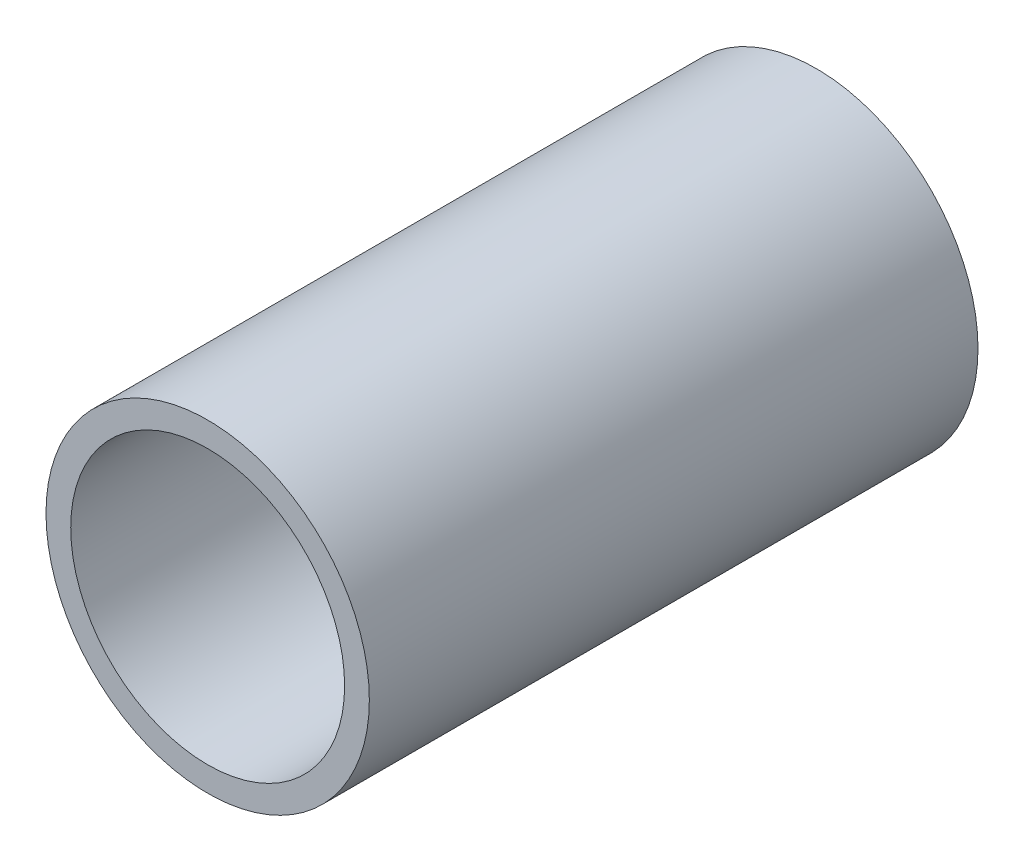
ISO-10303-21;
HEADER;
FILE_DESCRIPTION(('STEP AP214'),'2;1');
FILE_NAME('part.step','',(''),(''),'','','');
FILE_SCHEMA(('AUTOMOTIVE_DESIGN { 1 0 10303 214 1 1 1 1 }'));
ENDSEC;
DATA;
#1=APPLICATION_CONTEXT('core data for automotive mechanical design processes');
#2=APPLICATION_PROTOCOL_DEFINITION('international standard','automotive_design',2000,#1);
#3=PRODUCT_CONTEXT('',#1,'mechanical');
#4=PRODUCT('Part','Part','',(#3));
#5=PRODUCT_RELATED_PRODUCT_CATEGORY('part','',(#4));
#6=PRODUCT_DEFINITION_FORMATION('','',#4);
#7=PRODUCT_DEFINITION_CONTEXT('part definition',#1,'design');
#8=PRODUCT_DEFINITION('design','',#6,#7);
#9=PRODUCT_DEFINITION_SHAPE('','',#8);
#10=(LENGTH_UNIT() NAMED_UNIT(*) SI_UNIT(.MILLI.,.METRE.));
#11=(NAMED_UNIT(*) PLANE_ANGLE_UNIT() SI_UNIT($,.RADIAN.));
#12=(NAMED_UNIT(*) SI_UNIT($,.STERADIAN.) SOLID_ANGLE_UNIT());
#13=UNCERTAINTY_MEASURE_WITH_UNIT(LENGTH_MEASURE(1.E-05),#10,'distance_accuracy_value','');
#14=(GEOMETRIC_REPRESENTATION_CONTEXT(3) GLOBAL_UNCERTAINTY_ASSIGNED_CONTEXT((#13)) GLOBAL_UNIT_ASSIGNED_CONTEXT((#10,
#11,#12)) REPRESENTATION_CONTEXT('',''));
#15=CARTESIAN_POINT('',(0.,0.,0.));
#16=DIRECTION('',(0.,0.,1.));
#17=DIRECTION('',(1.,0.,0.));
#18=AXIS2_PLACEMENT_3D('',#15,#16,#17);
#19=CARTESIAN_POINT('',(10.1606171532936,18.1202292501439,2.59164927349457));
#20=DIRECTION('',(0.,0.,1.));
#21=DIRECTION('',(1.,0.,0.));
#22=AXIS2_PLACEMENT_3D('',#19,#20,#21);
#23=CYLINDRICAL_SURFACE('',#22,8.5);
#24=CARTESIAN_POINT('',(10.1606171532936,18.1202292501439,2.59164927349457));
#25=DIRECTION('',(0.,0.,1.));
#26=DIRECTION('',(1.,0.,0.));
#27=AXIS2_PLACEMENT_3D('',#24,#25,#26);
#28=CIRCLE('',#27,8.5);
#29=CARTESIAN_POINT('',(18.6606171532936,18.1202292501439,2.59164927349457));
#30=VERTEX_POINT('',#29);
#31=EDGE_CURVE('E10',#30,#30,#28,.T.);
#32=ORIENTED_EDGE('',*,*,#31,.T.);
#33=EDGE_LOOP('',(#32));
#34=FACE_BOUND('',#33,.T.);
#35=CARTESIAN_POINT('',(10.1606171532936,18.1202292501439,34.5916492734946));
#36=DIRECTION('',(0.,0.,-1.));
#37=DIRECTION('',(-1.,0.,0.));
#38=AXIS2_PLACEMENT_3D('',#35,#36,#37);
#39=CIRCLE('',#38,8.5);
#40=CARTESIAN_POINT('',(1.66061715329361,18.1202292501439,34.5916492734946));
#41=VERTEX_POINT('',#40);
#42=EDGE_CURVE('E45',#41,#41,#39,.T.);
#43=ORIENTED_EDGE('',*,*,#42,.T.);
#44=EDGE_LOOP('',(#43));
#45=FACE_BOUND('',#44,.T.);
#46=ADVANCED_FACE('F31',(#34,#45),#23,.T.);
#47=CARTESIAN_POINT('',(10.1606171532936,18.1202292501439,2.59164927349457));
#48=DIRECTION('',(0.,0.,1.));
#49=DIRECTION('',(1.,0.,0.));
#50=AXIS2_PLACEMENT_3D('',#47,#48,#49);
#51=PLANE('',#50);
#52=CARTESIAN_POINT('',(10.1606171532936,18.1202292501439,2.59164927349457));
#53=DIRECTION('',(0.,0.,1.));
#54=DIRECTION('',(1.,0.,0.));
#55=AXIS2_PLACEMENT_3D('',#52,#53,#54);
#56=CIRCLE('',#55,7.2);
#57=CARTESIAN_POINT('',(17.3606171532936,18.1202292501439,2.59164927349457));
#58=VERTEX_POINT('',#57);
#59=EDGE_CURVE('E37',#58,#58,#56,.T.);
#60=ORIENTED_EDGE('',*,*,#59,.T.);
#61=EDGE_LOOP('',(#60));
#62=FACE_BOUND('',#61,.T.);
#63=ORIENTED_EDGE('',*,*,#31,.F.);
#64=EDGE_LOOP('',(#63));
#65=FACE_BOUND('',#64,.T.);
#66=ADVANCED_FACE('F60',(#62,#65),#51,.F.);
#67=CARTESIAN_POINT('',(10.1606171532936,18.1202292501439,2.59164927349457));
#68=DIRECTION('',(0.,0.,1.));
#69=DIRECTION('',(1.,0.,0.));
#70=AXIS2_PLACEMENT_3D('',#67,#68,#69);
#71=CYLINDRICAL_SURFACE('',#70,7.2);
#72=ORIENTED_EDGE('',*,*,#59,.F.);
#73=EDGE_LOOP('',(#72));
#74=FACE_BOUND('',#73,.T.);
#75=CARTESIAN_POINT('',(10.1606171532936,18.1202292501439,34.5916492734946));
#76=DIRECTION('',(0.,0.,-1.));
#77=DIRECTION('',(-1.,0.,0.));
#78=AXIS2_PLACEMENT_3D('',#75,#76,#77);
#79=CIRCLE('',#78,7.2);
#80=CARTESIAN_POINT('',(2.96061715329361,18.1202292501439,34.5916492734946));
#81=VERTEX_POINT('',#80);
#82=EDGE_CURVE('E41',#81,#81,#79,.T.);
#83=ORIENTED_EDGE('',*,*,#82,.F.);
#84=EDGE_LOOP('',(#83));
#85=FACE_BOUND('',#84,.T.);
#86=ADVANCED_FACE('F54',(#74,#85),#71,.F.);
#87=CARTESIAN_POINT('',(10.1606171532936,18.1202292501439,34.5916492734946));
#88=DIRECTION('',(0.,0.,-1.));
#89=DIRECTION('',(-1.,0.,0.));
#90=AXIS2_PLACEMENT_3D('',#87,#88,#89);
#91=PLANE('',#90);
#92=ORIENTED_EDGE('',*,*,#82,.T.);
#93=EDGE_LOOP('',(#92));
#94=FACE_BOUND('',#93,.T.);
#95=ORIENTED_EDGE('',*,*,#42,.F.);
#96=EDGE_LOOP('',(#95));
#97=FACE_BOUND('',#96,.T.);
#98=ADVANCED_FACE('F52',(#94,#97),#91,.F.);
#99=CLOSED_SHELL('',(#46,#66,#86,#98));
#100=MANIFOLD_SOLID_BREP('B2',#99);
#101=ADVANCED_BREP_SHAPE_REPRESENTATION('',(#18,#100),#14);
#102=SHAPE_DEFINITION_REPRESENTATION(#9,#101);
ENDSEC;
END-ISO-10303-21;
